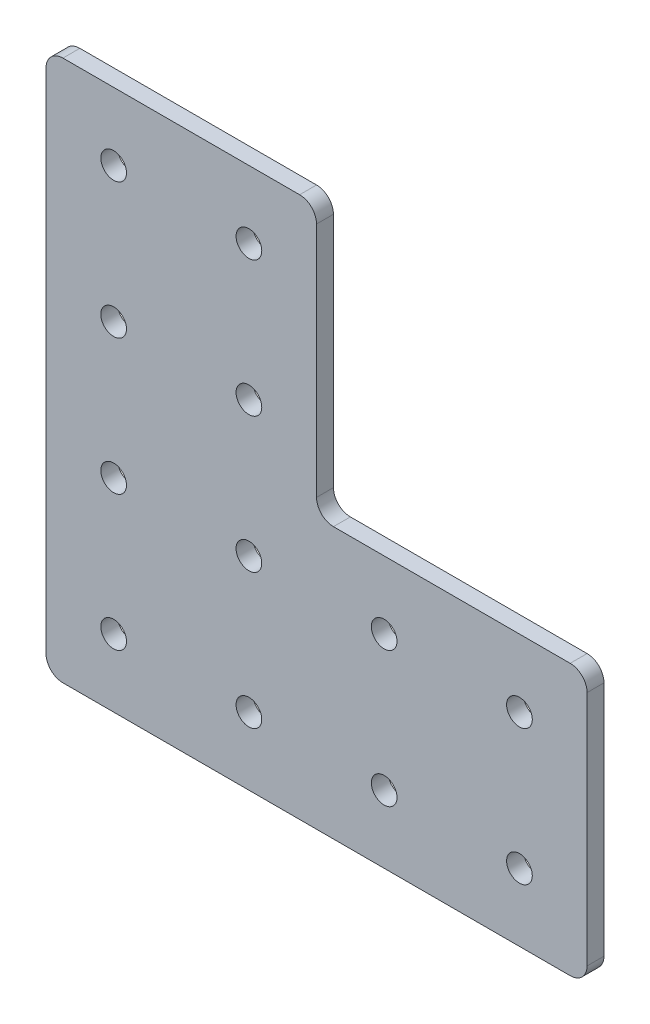
ISO-10303-21;
HEADER;
FILE_DESCRIPTION(('STEP AP214'),'2;1');
FILE_NAME('part.step','',(''),(''),'','','');
FILE_SCHEMA(('AUTOMOTIVE_DESIGN { 1 0 10303 214 1 1 1 1 }'));
ENDSEC;
DATA;
#1=APPLICATION_CONTEXT('core data for automotive mechanical design processes');
#2=APPLICATION_PROTOCOL_DEFINITION('international standard','automotive_design',2000,#1);
#3=PRODUCT_CONTEXT('',#1,'mechanical');
#4=PRODUCT('Part','Part','',(#3));
#5=PRODUCT_RELATED_PRODUCT_CATEGORY('part','',(#4));
#6=PRODUCT_DEFINITION_FORMATION('','',#4);
#7=PRODUCT_DEFINITION_CONTEXT('part definition',#1,'design');
#8=PRODUCT_DEFINITION('design','',#6,#7);
#9=PRODUCT_DEFINITION_SHAPE('','',#8);
#10=(LENGTH_UNIT() NAMED_UNIT(*) SI_UNIT(.MILLI.,.METRE.));
#11=(NAMED_UNIT(*) PLANE_ANGLE_UNIT() SI_UNIT($,.RADIAN.));
#12=(NAMED_UNIT(*) SI_UNIT($,.STERADIAN.) SOLID_ANGLE_UNIT());
#13=UNCERTAINTY_MEASURE_WITH_UNIT(LENGTH_MEASURE(1.E-05),#10,'distance_accuracy_value','');
#14=(GEOMETRIC_REPRESENTATION_CONTEXT(3) GLOBAL_UNCERTAINTY_ASSIGNED_CONTEXT((#13)) GLOBAL_UNIT_ASSIGNED_CONTEXT((#10,
#11,#12)) REPRESENTATION_CONTEXT('',''));
#15=CARTESIAN_POINT('',(0.,0.,0.));
#16=DIRECTION('',(0.,0.,1.));
#17=DIRECTION('',(1.,0.,0.));
#18=AXIS2_PLACEMENT_3D('',#15,#16,#17);
#19=CARTESIAN_POINT('',(0.,0.,3.175));
#20=DIRECTION('',(0.,0.,1.));
#21=DIRECTION('',(1.,0.,0.));
#22=AXIS2_PLACEMENT_3D('',#19,#20,#21);
#23=PLANE('',#22);
#24=CARTESIAN_POINT('',(63.5,38.1,3.175));
#25=DIRECTION('',(0.,0.,1.));
#26=DIRECTION('',(1.,0.,0.));
#27=AXIS2_PLACEMENT_3D('',#24,#25,#26);
#28=CIRCLE('',#27,2.41299999999999);
#29=CARTESIAN_POINT('',(65.913,38.1,3.175));
#30=VERTEX_POINT('',#29);
#31=EDGE_CURVE('E556',#30,#30,#28,.T.);
#32=ORIENTED_EDGE('',*,*,#31,.F.);
#33=EDGE_LOOP('',(#32));
#34=FACE_BOUND('',#33,.T.);
#35=CARTESIAN_POINT('',(88.9,12.7,3.175));
#36=DIRECTION('',(0.,0.,1.));
#37=DIRECTION('',(1.,0.,0.));
#38=AXIS2_PLACEMENT_3D('',#35,#36,#37);
#39=CIRCLE('',#38,2.41299999999999);
#40=CARTESIAN_POINT('',(91.313,12.7,3.175));
#41=VERTEX_POINT('',#40);
#42=EDGE_CURVE('E564',#41,#41,#39,.T.);
#43=ORIENTED_EDGE('',*,*,#42,.F.);
#44=EDGE_LOOP('',(#43));
#45=FACE_BOUND('',#44,.T.);
#46=CARTESIAN_POINT('',(12.7,38.1,3.175));
#47=DIRECTION('',(0.,0.,1.));
#48=DIRECTION('',(-1.,0.,0.));
#49=AXIS2_PLACEMENT_3D('',#46,#47,#48);
#50=CIRCLE('',#49,2.413);
#51=CARTESIAN_POINT('',(10.287,38.1,3.175));
#52=VERTEX_POINT('',#51);
#53=EDGE_CURVE('E572',#52,#52,#50,.T.);
#54=ORIENTED_EDGE('',*,*,#53,.F.);
#55=EDGE_LOOP('',(#54));
#56=FACE_BOUND('',#55,.T.);
#57=CARTESIAN_POINT('',(38.1,12.7,3.175));
#58=DIRECTION('',(0.,0.,1.));
#59=DIRECTION('',(-1.,0.,0.));
#60=AXIS2_PLACEMENT_3D('',#57,#58,#59);
#61=CIRCLE('',#60,2.41299999999999);
#62=CARTESIAN_POINT('',(35.687,12.7,3.175));
#63=VERTEX_POINT('',#62);
#64=EDGE_CURVE('E580',#63,#63,#61,.T.);
#65=ORIENTED_EDGE('',*,*,#64,.F.);
#66=EDGE_LOOP('',(#65));
#67=FACE_BOUND('',#66,.T.);
#68=CARTESIAN_POINT('',(38.1,63.5,3.175));
#69=DIRECTION('',(0.,0.,1.));
#70=DIRECTION('',(1.,0.,0.));
#71=AXIS2_PLACEMENT_3D('',#68,#69,#70);
#72=CIRCLE('',#71,2.41299999999999);
#73=CARTESIAN_POINT('',(40.513,63.5,3.175));
#74=VERTEX_POINT('',#73);
#75=EDGE_CURVE('E337',#74,#74,#72,.T.);
#76=ORIENTED_EDGE('',*,*,#75,.F.);
#77=EDGE_LOOP('',(#76));
#78=FACE_BOUND('',#77,.T.);
#79=CARTESIAN_POINT('',(12.7,88.9,3.175));
#80=DIRECTION('',(0.,0.,1.));
#81=DIRECTION('',(1.,0.,0.));
#82=AXIS2_PLACEMENT_3D('',#79,#80,#81);
#83=CIRCLE('',#82,2.413);
#84=CARTESIAN_POINT('',(15.113,88.9,3.175));
#85=VERTEX_POINT('',#84);
#86=EDGE_CURVE('E223',#85,#85,#83,.T.);
#87=ORIENTED_EDGE('',*,*,#86,.F.);
#88=EDGE_LOOP('',(#87));
#89=FACE_BOUND('',#88,.T.);
#90=DIRECTION('',(0.,1.,0.));
#91=VECTOR('',#90,1.);
#92=CARTESIAN_POINT('',(50.8,50.8,3.175));
#93=LINE('',#92,#91);
#94=CARTESIAN_POINT('',(50.8,53.975,3.175));
#95=VERTEX_POINT('',#94);
#96=CARTESIAN_POINT('',(50.8,98.425,3.175));
#97=VERTEX_POINT('',#96);
#98=EDGE_CURVE('E209',#95,#97,#93,.T.);
#99=ORIENTED_EDGE('',*,*,#98,.T.);
#100=CARTESIAN_POINT('',(47.625,98.425,3.175));
#101=DIRECTION('',(0.,0.,1.));
#102=DIRECTION('',(1.,0.,0.));
#103=AXIS2_PLACEMENT_3D('',#100,#101,#102);
#104=CIRCLE('',#103,3.175);
#105=CARTESIAN_POINT('',(47.625,101.6,3.175));
#106=VERTEX_POINT('',#105);
#107=EDGE_CURVE('E178',#97,#106,#104,.T.);
#108=ORIENTED_EDGE('',*,*,#107,.T.);
#109=DIRECTION('',(-1.,0.,0.));
#110=VECTOR('',#109,1.);
#111=CARTESIAN_POINT('',(50.8,101.6,3.175));
#112=LINE('',#111,#110);
#113=CARTESIAN_POINT('',(3.17500000000001,101.6,3.175));
#114=VERTEX_POINT('',#113);
#115=EDGE_CURVE('E144',#106,#114,#112,.T.);
#116=ORIENTED_EDGE('',*,*,#115,.T.);
#117=CARTESIAN_POINT('',(3.17500000000001,98.425,3.175));
#118=DIRECTION('',(0.,0.,1.));
#119=DIRECTION('',(1.,0.,0.));
#120=AXIS2_PLACEMENT_3D('',#117,#118,#119);
#121=CIRCLE('',#120,3.175);
#122=CARTESIAN_POINT('',(0.,98.425,3.175));
#123=VERTEX_POINT('',#122);
#124=EDGE_CURVE('E171',#114,#123,#121,.T.);
#125=ORIENTED_EDGE('',*,*,#124,.T.);
#126=DIRECTION('',(0.,-1.,0.));
#127=VECTOR('',#126,1.);
#128=CARTESIAN_POINT('',(0.,101.6,3.175));
#129=LINE('',#128,#127);
#130=CARTESIAN_POINT('',(0.,3.175,3.175));
#131=VERTEX_POINT('',#130);
#132=EDGE_CURVE('E151',#123,#131,#129,.T.);
#133=ORIENTED_EDGE('',*,*,#132,.T.);
#134=CARTESIAN_POINT('',(3.175,3.175,3.175));
#135=DIRECTION('',(0.,0.,1.));
#136=DIRECTION('',(1.,0.,0.));
#137=AXIS2_PLACEMENT_3D('',#134,#135,#136);
#138=CIRCLE('',#137,3.175);
#139=CARTESIAN_POINT('',(3.175,0.,3.175));
#140=VERTEX_POINT('',#139);
#141=EDGE_CURVE('E173',#131,#140,#138,.T.);
#142=ORIENTED_EDGE('',*,*,#141,.T.);
#143=DIRECTION('',(1.,0.,0.));
#144=VECTOR('',#143,1.);
#145=CARTESIAN_POINT('',(0.,0.,3.175));
#146=LINE('',#145,#144);
#147=CARTESIAN_POINT('',(98.425,0.,3.175));
#148=VERTEX_POINT('',#147);
#149=EDGE_CURVE('E155',#140,#148,#146,.T.);
#150=ORIENTED_EDGE('',*,*,#149,.T.);
#151=CARTESIAN_POINT('',(98.425,3.175,3.175));
#152=DIRECTION('',(0.,0.,1.));
#153=DIRECTION('',(1.,0.,0.));
#154=AXIS2_PLACEMENT_3D('',#151,#152,#153);
#155=CIRCLE('',#154,3.175);
#156=CARTESIAN_POINT('',(101.6,3.175,3.175));
#157=VERTEX_POINT('',#156);
#158=EDGE_CURVE('E175',#148,#157,#155,.T.);
#159=ORIENTED_EDGE('',*,*,#158,.T.);
#160=DIRECTION('',(0.,1.,0.));
#161=VECTOR('',#160,1.);
#162=CARTESIAN_POINT('',(101.6,0.,3.175));
#163=LINE('',#162,#161);
#164=CARTESIAN_POINT('',(101.6,47.625,3.175));
#165=VERTEX_POINT('',#164);
#166=EDGE_CURVE('E215',#157,#165,#163,.T.);
#167=ORIENTED_EDGE('',*,*,#166,.T.);
#168=CARTESIAN_POINT('',(98.425,47.625,3.175));
#169=DIRECTION('',(0.,0.,1.));
#170=DIRECTION('',(1.,0.,0.));
#171=AXIS2_PLACEMENT_3D('',#168,#169,#170);
#172=CIRCLE('',#171,3.175);
#173=CARTESIAN_POINT('',(98.425,50.8,3.175));
#174=VERTEX_POINT('',#173);
#175=EDGE_CURVE('E56',#165,#174,#172,.T.);
#176=ORIENTED_EDGE('',*,*,#175,.T.);
#177=DIRECTION('',(-1.,0.,0.));
#178=VECTOR('',#177,1.);
#179=CARTESIAN_POINT('',(101.6,50.8,3.175));
#180=LINE('',#179,#178);
#181=CARTESIAN_POINT('',(53.975,50.8,3.175));
#182=VERTEX_POINT('',#181);
#183=EDGE_CURVE('E210',#174,#182,#180,.T.);
#184=ORIENTED_EDGE('',*,*,#183,.T.);
#185=CARTESIAN_POINT('',(53.975,53.975,3.175));
#186=DIRECTION('',(0.,0.,1.));
#187=DIRECTION('',(1.,0.,0.));
#188=AXIS2_PLACEMENT_3D('',#185,#186,#187);
#189=CIRCLE('',#188,3.175);
#190=EDGE_CURVE('E11',#182,#95,#189,.F.);
#191=ORIENTED_EDGE('',*,*,#190,.T.);
#192=EDGE_LOOP('',(#99,#108,#116,#125,#133,#142,#150,#159,#167,#176,#184,#191));
#193=FACE_BOUND('',#192,.T.);
#194=CARTESIAN_POINT('',(38.1,88.9,3.175));
#195=DIRECTION('',(0.,0.,1.));
#196=DIRECTION('',(1.,0.,0.));
#197=AXIS2_PLACEMENT_3D('',#194,#195,#196);
#198=CIRCLE('',#197,2.41299999999999);
#199=CARTESIAN_POINT('',(40.513,88.9,3.175));
#200=VERTEX_POINT('',#199);
#201=EDGE_CURVE('E332',#200,#200,#198,.T.);
#202=ORIENTED_EDGE('',*,*,#201,.F.);
#203=EDGE_LOOP('',(#202));
#204=FACE_BOUND('',#203,.T.);
#205=CARTESIAN_POINT('',(12.7,63.5,3.175));
#206=DIRECTION('',(0.,0.,1.));
#207=DIRECTION('',(1.,0.,0.));
#208=AXIS2_PLACEMENT_3D('',#205,#206,#207);
#209=CIRCLE('',#208,2.413);
#210=CARTESIAN_POINT('',(15.113,63.5,3.175));
#211=VERTEX_POINT('',#210);
#212=EDGE_CURVE('E584',#211,#211,#209,.T.);
#213=ORIENTED_EDGE('',*,*,#212,.F.);
#214=EDGE_LOOP('',(#213));
#215=FACE_BOUND('',#214,.T.);
#216=CARTESIAN_POINT('',(38.1,38.1,3.175));
#217=DIRECTION('',(0.,0.,1.));
#218=DIRECTION('',(-1.,0.,0.));
#219=AXIS2_PLACEMENT_3D('',#216,#217,#218);
#220=CIRCLE('',#219,2.41299999999999);
#221=CARTESIAN_POINT('',(35.687,38.1,3.175));
#222=VERTEX_POINT('',#221);
#223=EDGE_CURVE('E576',#222,#222,#220,.T.);
#224=ORIENTED_EDGE('',*,*,#223,.F.);
#225=EDGE_LOOP('',(#224));
#226=FACE_BOUND('',#225,.T.);
#227=CARTESIAN_POINT('',(12.7,12.7,3.175));
#228=DIRECTION('',(0.,0.,1.));
#229=DIRECTION('',(-1.,0.,0.));
#230=AXIS2_PLACEMENT_3D('',#227,#228,#229);
#231=CIRCLE('',#230,2.413);
#232=CARTESIAN_POINT('',(10.287,12.7,3.175));
#233=VERTEX_POINT('',#232);
#234=EDGE_CURVE('E568',#233,#233,#231,.T.);
#235=ORIENTED_EDGE('',*,*,#234,.F.);
#236=EDGE_LOOP('',(#235));
#237=FACE_BOUND('',#236,.T.);
#238=CARTESIAN_POINT('',(63.5,12.7,3.175));
#239=DIRECTION('',(0.,0.,1.));
#240=DIRECTION('',(1.,0.,0.));
#241=AXIS2_PLACEMENT_3D('',#238,#239,#240);
#242=CIRCLE('',#241,2.413);
#243=CARTESIAN_POINT('',(65.913,12.7,3.175));
#244=VERTEX_POINT('',#243);
#245=EDGE_CURVE('E560',#244,#244,#242,.T.);
#246=ORIENTED_EDGE('',*,*,#245,.F.);
#247=EDGE_LOOP('',(#246));
#248=FACE_BOUND('',#247,.T.);
#249=CARTESIAN_POINT('',(88.9,38.1,3.175));
#250=DIRECTION('',(0.,0.,1.));
#251=DIRECTION('',(1.,0.,0.));
#252=AXIS2_PLACEMENT_3D('',#249,#250,#251);
#253=CIRCLE('',#252,2.41299999999999);
#254=CARTESIAN_POINT('',(91.313,38.1,3.175));
#255=VERTEX_POINT('',#254);
#256=EDGE_CURVE('E552',#255,#255,#253,.T.);
#257=ORIENTED_EDGE('',*,*,#256,.F.);
#258=EDGE_LOOP('',(#257));
#259=FACE_BOUND('',#258,.T.);
#260=ADVANCED_FACE('F34',(#34,#45,#56,#67,#78,#89,#193,#204,#215,#226,#237,#248,#259),#23,.T.);
#261=CARTESIAN_POINT('',(0.,0.,0.));
#262=DIRECTION('',(0.,0.,1.));
#263=DIRECTION('',(1.,0.,0.));
#264=AXIS2_PLACEMENT_3D('',#261,#262,#263);
#265=PLANE('',#264);
#266=DIRECTION('',(-1.,0.,0.));
#267=VECTOR('',#266,1.);
#268=CARTESIAN_POINT('',(50.8,101.6,0.));
#269=LINE('',#268,#267);
#270=CARTESIAN_POINT('',(47.625,101.6,0.));
#271=VERTEX_POINT('',#270);
#272=CARTESIAN_POINT('',(3.17500000000001,101.6,0.));
#273=VERTEX_POINT('',#272);
#274=EDGE_CURVE('E141',#271,#273,#269,.T.);
#275=ORIENTED_EDGE('',*,*,#274,.F.);
#276=CARTESIAN_POINT('',(47.625,98.425,0.));
#277=DIRECTION('',(0.,0.,1.));
#278=DIRECTION('',(1.,0.,0.));
#279=AXIS2_PLACEMENT_3D('',#276,#277,#278);
#280=CIRCLE('',#279,3.175);
#281=CARTESIAN_POINT('',(50.8,98.425,0.));
#282=VERTEX_POINT('',#281);
#283=EDGE_CURVE('E124',#271,#282,#280,.F.);
#284=ORIENTED_EDGE('',*,*,#283,.T.);
#285=DIRECTION('',(0.,1.,0.));
#286=VECTOR('',#285,1.);
#287=CARTESIAN_POINT('',(50.8,50.8,0.));
#288=LINE('',#287,#286);
#289=CARTESIAN_POINT('',(50.8,53.975,0.));
#290=VERTEX_POINT('',#289);
#291=EDGE_CURVE('E152',#290,#282,#288,.T.);
#292=ORIENTED_EDGE('',*,*,#291,.F.);
#293=CARTESIAN_POINT('',(53.975,53.975,0.));
#294=DIRECTION('',(0.,0.,1.));
#295=DIRECTION('',(1.,0.,0.));
#296=AXIS2_PLACEMENT_3D('',#293,#294,#295);
#297=CIRCLE('',#296,3.175);
#298=CARTESIAN_POINT('',(53.975,50.8,0.));
#299=VERTEX_POINT('',#298);
#300=EDGE_CURVE('E42',#290,#299,#297,.T.);
#301=ORIENTED_EDGE('',*,*,#300,.T.);
#302=DIRECTION('',(-1.,0.,0.));
#303=VECTOR('',#302,1.);
#304=CARTESIAN_POINT('',(101.6,50.8,0.));
#305=LINE('',#304,#303);
#306=CARTESIAN_POINT('',(98.425,50.8,0.));
#307=VERTEX_POINT('',#306);
#308=EDGE_CURVE('E157',#307,#299,#305,.T.);
#309=ORIENTED_EDGE('',*,*,#308,.F.);
#310=CARTESIAN_POINT('',(98.425,47.625,0.));
#311=DIRECTION('',(0.,0.,1.));
#312=DIRECTION('',(1.,0.,0.));
#313=AXIS2_PLACEMENT_3D('',#310,#311,#312);
#314=CIRCLE('',#313,3.175);
#315=CARTESIAN_POINT('',(101.6,47.625,0.));
#316=VERTEX_POINT('',#315);
#317=EDGE_CURVE('E135',#307,#316,#314,.F.);
#318=ORIENTED_EDGE('',*,*,#317,.T.);
#319=DIRECTION('',(0.,1.,0.));
#320=VECTOR('',#319,1.);
#321=CARTESIAN_POINT('',(101.6,0.,0.));
#322=LINE('',#321,#320);
#323=CARTESIAN_POINT('',(101.6,3.175,0.));
#324=VERTEX_POINT('',#323);
#325=EDGE_CURVE('E203',#324,#316,#322,.T.);
#326=ORIENTED_EDGE('',*,*,#325,.F.);
#327=CARTESIAN_POINT('',(98.425,3.175,0.));
#328=DIRECTION('',(0.,0.,1.));
#329=DIRECTION('',(1.,0.,0.));
#330=AXIS2_PLACEMENT_3D('',#327,#328,#329);
#331=CIRCLE('',#330,3.175);
#332=CARTESIAN_POINT('',(98.425,0.,0.));
#333=VERTEX_POINT('',#332);
#334=EDGE_CURVE('E165',#324,#333,#331,.F.);
#335=ORIENTED_EDGE('',*,*,#334,.T.);
#336=DIRECTION('',(1.,0.,0.));
#337=VECTOR('',#336,1.);
#338=CARTESIAN_POINT('',(0.,0.,0.));
#339=LINE('',#338,#337);
#340=CARTESIAN_POINT('',(3.175,0.,0.));
#341=VERTEX_POINT('',#340);
#342=EDGE_CURVE('E222',#341,#333,#339,.T.);
#343=ORIENTED_EDGE('',*,*,#342,.F.);
#344=CARTESIAN_POINT('',(3.175,3.175,0.));
#345=DIRECTION('',(0.,0.,1.));
#346=DIRECTION('',(1.,0.,0.));
#347=AXIS2_PLACEMENT_3D('',#344,#345,#346);
#348=CIRCLE('',#347,3.175);
#349=CARTESIAN_POINT('',(0.,3.175,0.));
#350=VERTEX_POINT('',#349);
#351=EDGE_CURVE('E163',#341,#350,#348,.F.);
#352=ORIENTED_EDGE('',*,*,#351,.T.);
#353=DIRECTION('',(0.,-1.,0.));
#354=VECTOR('',#353,1.);
#355=CARTESIAN_POINT('',(0.,101.6,0.));
#356=LINE('',#355,#354);
#357=CARTESIAN_POINT('',(0.,98.425,0.));
#358=VERTEX_POINT('',#357);
#359=EDGE_CURVE('E219',#358,#350,#356,.T.);
#360=ORIENTED_EDGE('',*,*,#359,.F.);
#361=CARTESIAN_POINT('',(3.17500000000001,98.425,0.));
#362=DIRECTION('',(0.,0.,1.));
#363=DIRECTION('',(1.,0.,0.));
#364=AXIS2_PLACEMENT_3D('',#361,#362,#363);
#365=CIRCLE('',#364,3.175);
#366=EDGE_CURVE('E145',#358,#273,#365,.F.);
#367=ORIENTED_EDGE('',*,*,#366,.T.);
#368=EDGE_LOOP('',(#275,#284,#292,#301,#309,#318,#326,#335,#343,#352,#360,#367));
#369=FACE_BOUND('',#368,.T.);
#370=CARTESIAN_POINT('',(12.7,88.9,0.));
#371=DIRECTION('',(0.,0.,1.));
#372=DIRECTION('',(1.,0.,0.));
#373=AXIS2_PLACEMENT_3D('',#370,#371,#372);
#374=CIRCLE('',#373,2.413);
#375=CARTESIAN_POINT('',(15.113,88.9,0.));
#376=VERTEX_POINT('',#375);
#377=EDGE_CURVE('E339',#376,#376,#374,.T.);
#378=ORIENTED_EDGE('',*,*,#377,.T.);
#379=EDGE_LOOP('',(#378));
#380=FACE_BOUND('',#379,.T.);
#381=CARTESIAN_POINT('',(38.1,88.9,0.));
#382=DIRECTION('',(0.,0.,1.));
#383=DIRECTION('',(1.,0.,0.));
#384=AXIS2_PLACEMENT_3D('',#381,#382,#383);
#385=CIRCLE('',#384,2.41299999999999);
#386=CARTESIAN_POINT('',(40.513,88.9,0.));
#387=VERTEX_POINT('',#386);
#388=EDGE_CURVE('E335',#387,#387,#385,.T.);
#389=ORIENTED_EDGE('',*,*,#388,.T.);
#390=EDGE_LOOP('',(#389));
#391=FACE_BOUND('',#390,.T.);
#392=CARTESIAN_POINT('',(38.1,63.5,0.));
#393=DIRECTION('',(0.,0.,1.));
#394=DIRECTION('',(1.,0.,0.));
#395=AXIS2_PLACEMENT_3D('',#392,#393,#394);
#396=CIRCLE('',#395,2.41299999999999);
#397=CARTESIAN_POINT('',(40.513,63.5,0.));
#398=VERTEX_POINT('',#397);
#399=EDGE_CURVE('E342',#398,#398,#396,.T.);
#400=ORIENTED_EDGE('',*,*,#399,.T.);
#401=EDGE_LOOP('',(#400));
#402=FACE_BOUND('',#401,.T.);
#403=CARTESIAN_POINT('',(12.7,63.5,0.));
#404=DIRECTION('',(0.,0.,1.));
#405=DIRECTION('',(1.,0.,0.));
#406=AXIS2_PLACEMENT_3D('',#403,#404,#405);
#407=CIRCLE('',#406,2.413);
#408=CARTESIAN_POINT('',(15.113,63.5,0.));
#409=VERTEX_POINT('',#408);
#410=EDGE_CURVE('E520',#409,#409,#407,.T.);
#411=ORIENTED_EDGE('',*,*,#410,.T.);
#412=EDGE_LOOP('',(#411));
#413=FACE_BOUND('',#412,.T.);
#414=CARTESIAN_POINT('',(38.1,12.7,0.));
#415=DIRECTION('',(0.,0.,1.));
#416=DIRECTION('',(-1.,0.,0.));
#417=AXIS2_PLACEMENT_3D('',#414,#415,#416);
#418=CIRCLE('',#417,2.41299999999999);
#419=CARTESIAN_POINT('',(35.687,12.7,0.));
#420=VERTEX_POINT('',#419);
#421=EDGE_CURVE('E524',#420,#420,#418,.T.);
#422=ORIENTED_EDGE('',*,*,#421,.T.);
#423=EDGE_LOOP('',(#422));
#424=FACE_BOUND('',#423,.T.);
#425=CARTESIAN_POINT('',(38.1,38.1,0.));
#426=DIRECTION('',(0.,0.,1.));
#427=DIRECTION('',(-1.,0.,0.));
#428=AXIS2_PLACEMENT_3D('',#425,#426,#427);
#429=CIRCLE('',#428,2.41299999999999);
#430=CARTESIAN_POINT('',(35.687,38.1,0.));
#431=VERTEX_POINT('',#430);
#432=EDGE_CURVE('E528',#431,#431,#429,.T.);
#433=ORIENTED_EDGE('',*,*,#432,.T.);
#434=EDGE_LOOP('',(#433));
#435=FACE_BOUND('',#434,.T.);
#436=CARTESIAN_POINT('',(12.7,38.1,0.));
#437=DIRECTION('',(0.,0.,1.));
#438=DIRECTION('',(-1.,0.,0.));
#439=AXIS2_PLACEMENT_3D('',#436,#437,#438);
#440=CIRCLE('',#439,2.413);
#441=CARTESIAN_POINT('',(10.287,38.1,0.));
#442=VERTEX_POINT('',#441);
#443=EDGE_CURVE('E532',#442,#442,#440,.T.);
#444=ORIENTED_EDGE('',*,*,#443,.T.);
#445=EDGE_LOOP('',(#444));
#446=FACE_BOUND('',#445,.T.);
#447=CARTESIAN_POINT('',(12.7,12.7,0.));
#448=DIRECTION('',(0.,0.,1.));
#449=DIRECTION('',(-1.,0.,0.));
#450=AXIS2_PLACEMENT_3D('',#447,#448,#449);
#451=CIRCLE('',#450,2.413);
#452=CARTESIAN_POINT('',(10.287,12.7,0.));
#453=VERTEX_POINT('',#452);
#454=EDGE_CURVE('E536',#453,#453,#451,.T.);
#455=ORIENTED_EDGE('',*,*,#454,.T.);
#456=EDGE_LOOP('',(#455));
#457=FACE_BOUND('',#456,.T.);
#458=CARTESIAN_POINT('',(88.9,12.7,0.));
#459=DIRECTION('',(0.,0.,1.));
#460=DIRECTION('',(1.,0.,0.));
#461=AXIS2_PLACEMENT_3D('',#458,#459,#460);
#462=CIRCLE('',#461,2.41299999999999);
#463=CARTESIAN_POINT('',(91.313,12.7,0.));
#464=VERTEX_POINT('',#463);
#465=EDGE_CURVE('E540',#464,#464,#462,.T.);
#466=ORIENTED_EDGE('',*,*,#465,.T.);
#467=EDGE_LOOP('',(#466));
#468=FACE_BOUND('',#467,.T.);
#469=CARTESIAN_POINT('',(63.5,12.7,0.));
#470=DIRECTION('',(0.,0.,1.));
#471=DIRECTION('',(1.,0.,0.));
#472=AXIS2_PLACEMENT_3D('',#469,#470,#471);
#473=CIRCLE('',#472,2.413);
#474=CARTESIAN_POINT('',(65.913,12.7,0.));
#475=VERTEX_POINT('',#474);
#476=EDGE_CURVE('E544',#475,#475,#473,.T.);
#477=ORIENTED_EDGE('',*,*,#476,.T.);
#478=EDGE_LOOP('',(#477));
#479=FACE_BOUND('',#478,.T.);
#480=CARTESIAN_POINT('',(63.5,38.1,0.));
#481=DIRECTION('',(0.,0.,1.));
#482=DIRECTION('',(1.,0.,0.));
#483=AXIS2_PLACEMENT_3D('',#480,#481,#482);
#484=CIRCLE('',#483,2.41299999999999);
#485=CARTESIAN_POINT('',(65.913,38.1,0.));
#486=VERTEX_POINT('',#485);
#487=EDGE_CURVE('E548',#486,#486,#484,.T.);
#488=ORIENTED_EDGE('',*,*,#487,.T.);
#489=EDGE_LOOP('',(#488));
#490=FACE_BOUND('',#489,.T.);
#491=CARTESIAN_POINT('',(88.9,38.1,0.));
#492=DIRECTION('',(0.,0.,1.));
#493=DIRECTION('',(1.,0.,0.));
#494=AXIS2_PLACEMENT_3D('',#491,#492,#493);
#495=CIRCLE('',#494,2.41299999999999);
#496=CARTESIAN_POINT('',(91.313,38.1,0.));
#497=VERTEX_POINT('',#496);
#498=EDGE_CURVE('E551',#497,#497,#495,.T.);
#499=ORIENTED_EDGE('',*,*,#498,.T.);
#500=EDGE_LOOP('',(#499));
#501=FACE_BOUND('',#500,.T.);
#502=ADVANCED_FACE('F148',(#369,#380,#391,#402,#413,#424,#435,#446,#457,#468,#479,#490,#501),
#265,.F.);
#503=CARTESIAN_POINT('',(0.,101.6,3.175));
#504=DIRECTION('',(1.,0.,0.));
#505=DIRECTION('',(0.,1.,0.));
#506=AXIS2_PLACEMENT_3D('',#503,#504,#505);
#507=PLANE('',#506);
#508=ORIENTED_EDGE('',*,*,#359,.T.);
#509=DIRECTION('',(0.,0.,-1.));
#510=VECTOR('',#509,1.);
#511=CARTESIAN_POINT('',(0.,3.175,3.175));
#512=LINE('',#511,#510);
#513=EDGE_CURVE('E197',#350,#131,#512,.F.);
#514=ORIENTED_EDGE('',*,*,#513,.T.);
#515=ORIENTED_EDGE('',*,*,#132,.F.);
#516=DIRECTION('',(0.,0.,-1.));
#517=VECTOR('',#516,1.);
#518=CARTESIAN_POINT('',(0.,98.425,3.175));
#519=LINE('',#518,#517);
#520=EDGE_CURVE('E194',#123,#358,#519,.T.);
#521=ORIENTED_EDGE('',*,*,#520,.T.);
#522=EDGE_LOOP('',(#508,#514,#515,#521));
#523=FACE_BOUND('',#522,.T.);
#524=ADVANCED_FACE('F252',(#523),#507,.F.);
#525=CARTESIAN_POINT('',(0.,0.,3.175));
#526=DIRECTION('',(0.,1.,0.));
#527=DIRECTION('',(0.,0.,1.));
#528=AXIS2_PLACEMENT_3D('',#525,#526,#527);
#529=PLANE('',#528);
#530=ORIENTED_EDGE('',*,*,#342,.T.);
#531=DIRECTION('',(0.,0.,-1.));
#532=VECTOR('',#531,1.);
#533=CARTESIAN_POINT('',(98.425,0.,3.175));
#534=LINE('',#533,#532);
#535=EDGE_CURVE('E192',#333,#148,#534,.F.);
#536=ORIENTED_EDGE('',*,*,#535,.T.);
#537=ORIENTED_EDGE('',*,*,#149,.F.);
#538=DIRECTION('',(0.,0.,-1.));
#539=VECTOR('',#538,1.);
#540=CARTESIAN_POINT('',(3.175,0.,3.175));
#541=LINE('',#540,#539);
#542=EDGE_CURVE('E189',#140,#341,#541,.T.);
#543=ORIENTED_EDGE('',*,*,#542,.T.);
#544=EDGE_LOOP('',(#530,#536,#537,#543));
#545=FACE_BOUND('',#544,.T.);
#546=ADVANCED_FACE('F268',(#545),#529,.F.);
#547=CARTESIAN_POINT('',(101.6,0.,3.175));
#548=DIRECTION('',(-1.,0.,0.));
#549=DIRECTION('',(0.,0.,1.));
#550=AXIS2_PLACEMENT_3D('',#547,#548,#549);
#551=PLANE('',#550);
#552=ORIENTED_EDGE('',*,*,#325,.T.);
#553=DIRECTION('',(0.,0.,-1.));
#554=VECTOR('',#553,1.);
#555=CARTESIAN_POINT('',(101.6,47.625,3.175));
#556=LINE('',#555,#554);
#557=EDGE_CURVE('E187',#316,#165,#556,.F.);
#558=ORIENTED_EDGE('',*,*,#557,.T.);
#559=ORIENTED_EDGE('',*,*,#166,.F.);
#560=DIRECTION('',(0.,0.,-1.));
#561=VECTOR('',#560,1.);
#562=CARTESIAN_POINT('',(101.6,3.175,3.175));
#563=LINE('',#562,#561);
#564=EDGE_CURVE('E184',#157,#324,#563,.T.);
#565=ORIENTED_EDGE('',*,*,#564,.T.);
#566=EDGE_LOOP('',(#552,#558,#559,#565));
#567=FACE_BOUND('',#566,.T.);
#568=ADVANCED_FACE('F230',(#567),#551,.F.);
#569=CARTESIAN_POINT('',(101.6,50.8,3.175));
#570=DIRECTION('',(0.,-1.,0.));
#571=DIRECTION('',(1.,0.,0.));
#572=AXIS2_PLACEMENT_3D('',#569,#570,#571);
#573=PLANE('',#572);
#574=ORIENTED_EDGE('',*,*,#308,.T.);
#575=DIRECTION('',(0.,0.,-1.));
#576=VECTOR('',#575,1.);
#577=CARTESIAN_POINT('',(53.975,50.8,3.175));
#578=LINE('',#577,#576);
#579=EDGE_CURVE('E49',#299,#182,#578,.F.);
#580=ORIENTED_EDGE('',*,*,#579,.T.);
#581=ORIENTED_EDGE('',*,*,#183,.F.);
#582=DIRECTION('',(0.,0.,-1.));
#583=VECTOR('',#582,1.);
#584=CARTESIAN_POINT('',(98.425,50.8,3.175));
#585=LINE('',#584,#583);
#586=EDGE_CURVE('E180',#174,#307,#585,.T.);
#587=ORIENTED_EDGE('',*,*,#586,.T.);
#588=EDGE_LOOP('',(#574,#580,#581,#587));
#589=FACE_BOUND('',#588,.T.);
#590=ADVANCED_FACE('F201',(#589),#573,.F.);
#591=CARTESIAN_POINT('',(50.8,50.8,3.175));
#592=DIRECTION('',(-1.,0.,0.));
#593=DIRECTION('',(0.,-1.,0.));
#594=AXIS2_PLACEMENT_3D('',#591,#592,#593);
#595=PLANE('',#594);
#596=ORIENTED_EDGE('',*,*,#291,.T.);
#597=DIRECTION('',(0.,0.,-1.));
#598=VECTOR('',#597,1.);
#599=CARTESIAN_POINT('',(50.8,98.425,3.175));
#600=LINE('',#599,#598);
#601=EDGE_CURVE('E129',#282,#97,#600,.F.);
#602=ORIENTED_EDGE('',*,*,#601,.T.);
#603=ORIENTED_EDGE('',*,*,#98,.F.);
#604=DIRECTION('',(0.,0.,-1.));
#605=VECTOR('',#604,1.);
#606=CARTESIAN_POINT('',(50.8,53.975,0.));
#607=LINE('',#606,#605);
#608=EDGE_CURVE('E134',#95,#290,#607,.T.);
#609=ORIENTED_EDGE('',*,*,#608,.T.);
#610=EDGE_LOOP('',(#596,#602,#603,#609));
#611=FACE_BOUND('',#610,.T.);
#612=ADVANCED_FACE('F212',(#611),#595,.F.);
#613=CARTESIAN_POINT('',(50.8,101.6,3.175));
#614=DIRECTION('',(0.,-1.,0.));
#615=DIRECTION('',(0.,0.,-1.));
#616=AXIS2_PLACEMENT_3D('',#613,#614,#615);
#617=PLANE('',#616);
#618=ORIENTED_EDGE('',*,*,#115,.F.);
#619=DIRECTION('',(0.,0.,-1.));
#620=VECTOR('',#619,1.);
#621=CARTESIAN_POINT('',(47.625,101.6,3.175));
#622=LINE('',#621,#620);
#623=EDGE_CURVE('E128',#106,#271,#622,.T.);
#624=ORIENTED_EDGE('',*,*,#623,.T.);
#625=ORIENTED_EDGE('',*,*,#274,.T.);
#626=DIRECTION('',(0.,0.,-1.));
#627=VECTOR('',#626,1.);
#628=CARTESIAN_POINT('',(3.17500000000001,101.6,3.175));
#629=LINE('',#628,#627);
#630=EDGE_CURVE('E146',#273,#114,#629,.F.);
#631=ORIENTED_EDGE('',*,*,#630,.T.);
#632=EDGE_LOOP('',(#618,#624,#625,#631));
#633=FACE_BOUND('',#632,.T.);
#634=ADVANCED_FACE('F140',(#633),#617,.F.);
#635=CARTESIAN_POINT('',(12.7,88.9,3.175));
#636=DIRECTION('',(0.,0.,-1.));
#637=DIRECTION('',(-1.,0.,0.));
#638=AXIS2_PLACEMENT_3D('',#635,#636,#637);
#639=CYLINDRICAL_SURFACE('',#638,2.413);
#640=ORIENTED_EDGE('',*,*,#86,.T.);
#641=EDGE_LOOP('',(#640));
#642=FACE_BOUND('',#641,.T.);
#643=ORIENTED_EDGE('',*,*,#377,.F.);
#644=EDGE_LOOP('',(#643));
#645=FACE_BOUND('',#644,.T.);
#646=ADVANCED_FACE('F257',(#642,#645),#639,.F.);
#647=CARTESIAN_POINT('',(38.1,88.9,3.175));
#648=DIRECTION('',(0.,0.,-1.));
#649=DIRECTION('',(-1.,0.,0.));
#650=AXIS2_PLACEMENT_3D('',#647,#648,#649);
#651=CYLINDRICAL_SURFACE('',#650,2.41299999999999);
#652=ORIENTED_EDGE('',*,*,#201,.T.);
#653=EDGE_LOOP('',(#652));
#654=FACE_BOUND('',#653,.T.);
#655=ORIENTED_EDGE('',*,*,#388,.F.);
#656=EDGE_LOOP('',(#655));
#657=FACE_BOUND('',#656,.T.);
#658=ADVANCED_FACE('F321',(#654,#657),#651,.F.);
#659=CARTESIAN_POINT('',(38.1,63.5,3.175));
#660=DIRECTION('',(0.,0.,-1.));
#661=DIRECTION('',(-1.,0.,0.));
#662=AXIS2_PLACEMENT_3D('',#659,#660,#661);
#663=CYLINDRICAL_SURFACE('',#662,2.41299999999999);
#664=ORIENTED_EDGE('',*,*,#75,.T.);
#665=EDGE_LOOP('',(#664));
#666=FACE_BOUND('',#665,.T.);
#667=ORIENTED_EDGE('',*,*,#399,.F.);
#668=EDGE_LOOP('',(#667));
#669=FACE_BOUND('',#668,.T.);
#670=ADVANCED_FACE('F318',(#666,#669),#663,.F.);
#671=CARTESIAN_POINT('',(12.7,63.5,3.175));
#672=DIRECTION('',(0.,0.,-1.));
#673=DIRECTION('',(-1.,0.,0.));
#674=AXIS2_PLACEMENT_3D('',#671,#672,#673);
#675=CYLINDRICAL_SURFACE('',#674,2.413);
#676=ORIENTED_EDGE('',*,*,#212,.T.);
#677=EDGE_LOOP('',(#676));
#678=FACE_BOUND('',#677,.T.);
#679=ORIENTED_EDGE('',*,*,#410,.F.);
#680=EDGE_LOOP('',(#679));
#681=FACE_BOUND('',#680,.T.);
#682=ADVANCED_FACE('F314',(#678,#681),#675,.F.);
#683=CARTESIAN_POINT('',(38.1,12.7,3.175));
#684=DIRECTION('',(0.,0.,-1.));
#685=DIRECTION('',(-1.,0.,0.));
#686=AXIS2_PLACEMENT_3D('',#683,#684,#685);
#687=CYLINDRICAL_SURFACE('',#686,2.41299999999999);
#688=ORIENTED_EDGE('',*,*,#64,.T.);
#689=EDGE_LOOP('',(#688));
#690=FACE_BOUND('',#689,.T.);
#691=ORIENTED_EDGE('',*,*,#421,.F.);
#692=EDGE_LOOP('',(#691));
#693=FACE_BOUND('',#692,.T.);
#694=ADVANCED_FACE('F310',(#690,#693),#687,.F.);
#695=CARTESIAN_POINT('',(38.1,38.1,3.175));
#696=DIRECTION('',(0.,0.,-1.));
#697=DIRECTION('',(-1.,0.,0.));
#698=AXIS2_PLACEMENT_3D('',#695,#696,#697);
#699=CYLINDRICAL_SURFACE('',#698,2.41299999999999);
#700=ORIENTED_EDGE('',*,*,#223,.T.);
#701=EDGE_LOOP('',(#700));
#702=FACE_BOUND('',#701,.T.);
#703=ORIENTED_EDGE('',*,*,#432,.F.);
#704=EDGE_LOOP('',(#703));
#705=FACE_BOUND('',#704,.T.);
#706=ADVANCED_FACE('F306',(#702,#705),#699,.F.);
#707=CARTESIAN_POINT('',(12.7,38.1,3.175));
#708=DIRECTION('',(0.,0.,-1.));
#709=DIRECTION('',(-1.,0.,0.));
#710=AXIS2_PLACEMENT_3D('',#707,#708,#709);
#711=CYLINDRICAL_SURFACE('',#710,2.413);
#712=ORIENTED_EDGE('',*,*,#53,.T.);
#713=EDGE_LOOP('',(#712));
#714=FACE_BOUND('',#713,.T.);
#715=ORIENTED_EDGE('',*,*,#443,.F.);
#716=EDGE_LOOP('',(#715));
#717=FACE_BOUND('',#716,.T.);
#718=ADVANCED_FACE('F302',(#714,#717),#711,.F.);
#719=CARTESIAN_POINT('',(12.7,12.7,3.175));
#720=DIRECTION('',(0.,0.,-1.));
#721=DIRECTION('',(-1.,0.,0.));
#722=AXIS2_PLACEMENT_3D('',#719,#720,#721);
#723=CYLINDRICAL_SURFACE('',#722,2.413);
#724=ORIENTED_EDGE('',*,*,#234,.T.);
#725=EDGE_LOOP('',(#724));
#726=FACE_BOUND('',#725,.T.);
#727=ORIENTED_EDGE('',*,*,#454,.F.);
#728=EDGE_LOOP('',(#727));
#729=FACE_BOUND('',#728,.T.);
#730=ADVANCED_FACE('F298',(#726,#729),#723,.F.);
#731=CARTESIAN_POINT('',(88.9,12.7,3.175));
#732=DIRECTION('',(0.,0.,-1.));
#733=DIRECTION('',(-1.,0.,0.));
#734=AXIS2_PLACEMENT_3D('',#731,#732,#733);
#735=CYLINDRICAL_SURFACE('',#734,2.41299999999999);
#736=ORIENTED_EDGE('',*,*,#42,.T.);
#737=EDGE_LOOP('',(#736));
#738=FACE_BOUND('',#737,.T.);
#739=ORIENTED_EDGE('',*,*,#465,.F.);
#740=EDGE_LOOP('',(#739));
#741=FACE_BOUND('',#740,.T.);
#742=ADVANCED_FACE('F294',(#738,#741),#735,.F.);
#743=CARTESIAN_POINT('',(63.5,12.7,3.175));
#744=DIRECTION('',(0.,0.,-1.));
#745=DIRECTION('',(-1.,0.,0.));
#746=AXIS2_PLACEMENT_3D('',#743,#744,#745);
#747=CYLINDRICAL_SURFACE('',#746,2.413);
#748=ORIENTED_EDGE('',*,*,#245,.T.);
#749=EDGE_LOOP('',(#748));
#750=FACE_BOUND('',#749,.T.);
#751=ORIENTED_EDGE('',*,*,#476,.F.);
#752=EDGE_LOOP('',(#751));
#753=FACE_BOUND('',#752,.T.);
#754=ADVANCED_FACE('F286',(#750,#753),#747,.F.);
#755=CARTESIAN_POINT('',(63.5,38.1,3.175));
#756=DIRECTION('',(0.,0.,-1.));
#757=DIRECTION('',(-1.,0.,0.));
#758=AXIS2_PLACEMENT_3D('',#755,#756,#757);
#759=CYLINDRICAL_SURFACE('',#758,2.41299999999999);
#760=ORIENTED_EDGE('',*,*,#31,.T.);
#761=EDGE_LOOP('',(#760));
#762=FACE_BOUND('',#761,.T.);
#763=ORIENTED_EDGE('',*,*,#487,.F.);
#764=EDGE_LOOP('',(#763));
#765=FACE_BOUND('',#764,.T.);
#766=ADVANCED_FACE('F280',(#762,#765),#759,.F.);
#767=CARTESIAN_POINT('',(88.9,38.1,3.175));
#768=DIRECTION('',(0.,0.,-1.));
#769=DIRECTION('',(-1.,0.,0.));
#770=AXIS2_PLACEMENT_3D('',#767,#768,#769);
#771=CYLINDRICAL_SURFACE('',#770,2.41299999999999);
#772=ORIENTED_EDGE('',*,*,#256,.T.);
#773=EDGE_LOOP('',(#772));
#774=FACE_BOUND('',#773,.T.);
#775=ORIENTED_EDGE('',*,*,#498,.F.);
#776=EDGE_LOOP('',(#775));
#777=FACE_BOUND('',#776,.T.);
#778=ADVANCED_FACE('F276',(#774,#777),#771,.F.);
#779=CARTESIAN_POINT('',(47.625,98.425,3.175));
#780=DIRECTION('',(0.,0.,-1.));
#781=DIRECTION('',(-1.,0.,0.));
#782=AXIS2_PLACEMENT_3D('',#779,#780,#781);
#783=CYLINDRICAL_SURFACE('',#782,3.175);
#784=ORIENTED_EDGE('',*,*,#107,.F.);
#785=ORIENTED_EDGE('',*,*,#601,.F.);
#786=ORIENTED_EDGE('',*,*,#283,.F.);
#787=ORIENTED_EDGE('',*,*,#623,.F.);
#788=EDGE_LOOP('',(#784,#785,#786,#787));
#789=FACE_BOUND('',#788,.T.);
#790=ADVANCED_FACE('F127',(#789),#783,.T.);
#791=CARTESIAN_POINT('',(53.975,53.975,3.175));
#792=DIRECTION('',(0.,0.,1.));
#793=DIRECTION('',(1.,0.,0.));
#794=AXIS2_PLACEMENT_3D('',#791,#792,#793);
#795=CYLINDRICAL_SURFACE('',#794,3.175);
#796=ORIENTED_EDGE('',*,*,#190,.F.);
#797=ORIENTED_EDGE('',*,*,#579,.F.);
#798=ORIENTED_EDGE('',*,*,#300,.F.);
#799=ORIENTED_EDGE('',*,*,#608,.F.);
#800=EDGE_LOOP('',(#796,#797,#798,#799));
#801=FACE_BOUND('',#800,.T.);
#802=ADVANCED_FACE('F205',(#801),#795,.F.);
#803=CARTESIAN_POINT('',(98.425,47.625,3.175));
#804=DIRECTION('',(0.,0.,-1.));
#805=DIRECTION('',(-1.,0.,0.));
#806=AXIS2_PLACEMENT_3D('',#803,#804,#805);
#807=CYLINDRICAL_SURFACE('',#806,3.175);
#808=ORIENTED_EDGE('',*,*,#175,.F.);
#809=ORIENTED_EDGE('',*,*,#557,.F.);
#810=ORIENTED_EDGE('',*,*,#317,.F.);
#811=ORIENTED_EDGE('',*,*,#586,.F.);
#812=EDGE_LOOP('',(#808,#809,#810,#811));
#813=FACE_BOUND('',#812,.T.);
#814=ADVANCED_FACE('F234',(#813),#807,.T.);
#815=CARTESIAN_POINT('',(98.425,3.175,3.175));
#816=DIRECTION('',(0.,0.,-1.));
#817=DIRECTION('',(-1.,0.,0.));
#818=AXIS2_PLACEMENT_3D('',#815,#816,#817);
#819=CYLINDRICAL_SURFACE('',#818,3.175);
#820=ORIENTED_EDGE('',*,*,#158,.F.);
#821=ORIENTED_EDGE('',*,*,#535,.F.);
#822=ORIENTED_EDGE('',*,*,#334,.F.);
#823=ORIENTED_EDGE('',*,*,#564,.F.);
#824=EDGE_LOOP('',(#820,#821,#822,#823));
#825=FACE_BOUND('',#824,.T.);
#826=ADVANCED_FACE('F236',(#825),#819,.T.);
#827=CARTESIAN_POINT('',(3.175,3.175,3.175));
#828=DIRECTION('',(0.,0.,-1.));
#829=DIRECTION('',(-1.,0.,0.));
#830=AXIS2_PLACEMENT_3D('',#827,#828,#829);
#831=CYLINDRICAL_SURFACE('',#830,3.175);
#832=ORIENTED_EDGE('',*,*,#141,.F.);
#833=ORIENTED_EDGE('',*,*,#513,.F.);
#834=ORIENTED_EDGE('',*,*,#351,.F.);
#835=ORIENTED_EDGE('',*,*,#542,.F.);
#836=EDGE_LOOP('',(#832,#833,#834,#835));
#837=FACE_BOUND('',#836,.T.);
#838=ADVANCED_FACE('F242',(#837),#831,.T.);
#839=CARTESIAN_POINT('',(3.17500000000001,98.425,3.175));
#840=DIRECTION('',(0.,0.,-1.));
#841=DIRECTION('',(-1.,0.,0.));
#842=AXIS2_PLACEMENT_3D('',#839,#840,#841);
#843=CYLINDRICAL_SURFACE('',#842,3.175);
#844=ORIENTED_EDGE('',*,*,#124,.F.);
#845=ORIENTED_EDGE('',*,*,#630,.F.);
#846=ORIENTED_EDGE('',*,*,#366,.F.);
#847=ORIENTED_EDGE('',*,*,#520,.F.);
#848=EDGE_LOOP('',(#844,#845,#846,#847));
#849=FACE_BOUND('',#848,.T.);
#850=ADVANCED_FACE('F36',(#849),#843,.T.);
#851=CLOSED_SHELL('',(#260,#502,#524,#546,#568,#590,#612,#634,#646,#658,#670,#682,#694,#706,
#718,#730,#742,#754,#766,#778,#790,#802,#814,#826,#838,#850));
#852=MANIFOLD_SOLID_BREP('B2',#851);
#853=ADVANCED_BREP_SHAPE_REPRESENTATION('',(#18,#852),#14);
#854=SHAPE_DEFINITION_REPRESENTATION(#9,#853);
ENDSEC;
END-ISO-10303-21;
